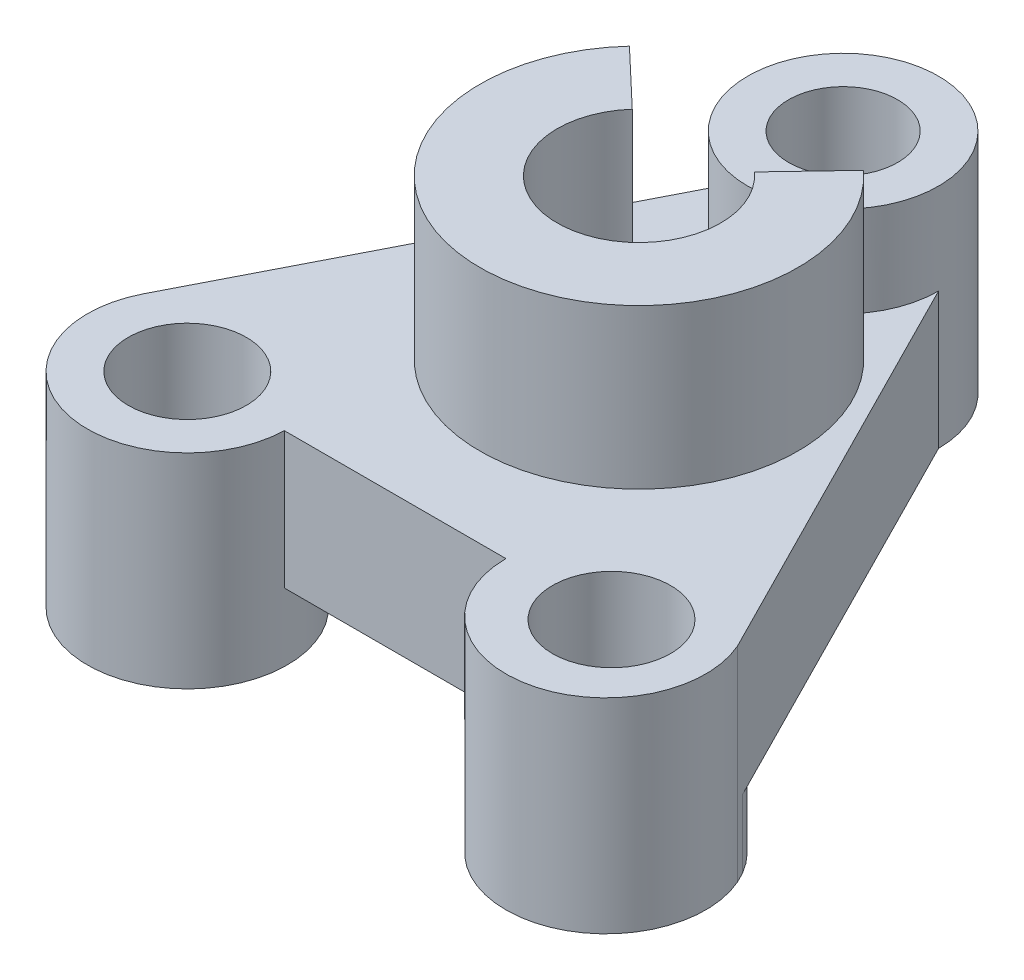
ISO-10303-21;
HEADER;
FILE_DESCRIPTION(('STEP AP214'),'2;1');
FILE_NAME('part.step','',(''),(''),'','','');
FILE_SCHEMA(('AUTOMOTIVE_DESIGN { 1 0 10303 214 1 1 1 1 }'));
ENDSEC;
DATA;
#1=APPLICATION_CONTEXT('core data for automotive mechanical design processes');
#2=APPLICATION_PROTOCOL_DEFINITION('international standard','automotive_design',2000,#1);
#3=PRODUCT_CONTEXT('',#1,'mechanical');
#4=PRODUCT('Part','Part','',(#3));
#5=PRODUCT_RELATED_PRODUCT_CATEGORY('part','',(#4));
#6=PRODUCT_DEFINITION_FORMATION('','',#4);
#7=PRODUCT_DEFINITION_CONTEXT('part definition',#1,'design');
#8=PRODUCT_DEFINITION('design','',#6,#7);
#9=PRODUCT_DEFINITION_SHAPE('','',#8);
#10=(LENGTH_UNIT() NAMED_UNIT(*) SI_UNIT(.MILLI.,.METRE.));
#11=(NAMED_UNIT(*) PLANE_ANGLE_UNIT() SI_UNIT($,.RADIAN.));
#12=(NAMED_UNIT(*) SI_UNIT($,.STERADIAN.) SOLID_ANGLE_UNIT());
#13=UNCERTAINTY_MEASURE_WITH_UNIT(LENGTH_MEASURE(1.E-05),#10,'distance_accuracy_value','');
#14=(GEOMETRIC_REPRESENTATION_CONTEXT(3) GLOBAL_UNCERTAINTY_ASSIGNED_CONTEXT((#13)) GLOBAL_UNIT_ASSIGNED_CONTEXT((#10,
#11,#12)) REPRESENTATION_CONTEXT('',''));
#15=CARTESIAN_POINT('',(0.,0.,0.));
#16=DIRECTION('',(0.,0.,1.));
#17=DIRECTION('',(1.,0.,0.));
#18=AXIS2_PLACEMENT_3D('',#15,#16,#17);
#19=CARTESIAN_POINT('',(0.,-30.,0.));
#20=DIRECTION('',(0.,1.,0.));
#21=DIRECTION('',(0.,0.,1.));
#22=AXIS2_PLACEMENT_3D('',#19,#20,#21);
#23=PLANE('',#22);
#24=CARTESIAN_POINT('',(-42.7481511678744,-30.,-83.4945297003622));
#25=DIRECTION('',(0.,1.,0.));
#26=DIRECTION('',(0.,0.,1.));
#27=AXIS2_PLACEMENT_3D('',#24,#25,#26);
#28=CIRCLE('',#27,12.);
#29=CARTESIAN_POINT('',(-42.7481511678744,-30.,-71.4945297003622));
#30=VERTEX_POINT('',#29);
#31=EDGE_CURVE('E184',#30,#30,#28,.T.);
#32=ORIENTED_EDGE('',*,*,#31,.T.);
#33=EDGE_LOOP('',(#32));
#34=FACE_BOUND('',#33,.T.);
#35=CARTESIAN_POINT('',(-89.1312520447951,-30.,14.5054702996378));
#36=DIRECTION('',(0.,1.,0.));
#37=DIRECTION('',(0.,0.,1.));
#38=AXIS2_PLACEMENT_3D('',#35,#36,#37);
#39=CIRCLE('',#38,22.);
#40=CARTESIAN_POINT('',(-108.720702630866,-30.,4.49280703076323));
#41=VERTEX_POINT('',#40);
#42=CARTESIAN_POINT('',(-67.1400575238637,-30.,15.1278556646305));
#43=VERTEX_POINT('',#42);
#44=EDGE_CURVE('E11',#41,#43,#39,.F.);
#45=ORIENTED_EDGE('',*,*,#44,.F.);
#46=DIRECTION('',(0.455121057676114,0.,-0.890429572094152));
#47=VECTOR('',#46,1.);
#48=CARTESIAN_POINT('',(-84.3800959878936,-30.,-43.128799555145));
#49=LINE('',#48,#47);
#50=CARTESIAN_POINT('',(-63.7481511678744,-30.,-83.4945297003622));
#51=VERTEX_POINT('',#50);
#52=EDGE_CURVE('E97',#41,#51,#49,.T.);
#53=ORIENTED_EDGE('',*,*,#52,.T.);
#54=CARTESIAN_POINT('',(-42.7481511678744,-30.,-83.4945297003622));
#55=DIRECTION('',(0.,1.,0.));
#56=DIRECTION('',(0.,0.,1.));
#57=AXIS2_PLACEMENT_3D('',#54,#55,#56);
#58=CIRCLE('',#57,21.);
#59=CARTESIAN_POINT('',(-21.7481511678744,-30.,-83.4945297003622));
#60=VERTEX_POINT('',#59);
#61=EDGE_CURVE('E157',#60,#51,#58,.T.);
#62=ORIENTED_EDGE('',*,*,#61,.F.);
#63=DIRECTION('',(-0.452339847965875,0.,-0.891845649169299));
#64=VECTOR('',#63,1.);
#65=CARTESIAN_POINT('',(16.3849069963001,-30.,-8.31034646695291));
#66=LINE('',#65,#64);
#67=CARTESIAN_POINT('',(22.6735761528181,-30.,4.08856610183062));
#68=VERTEX_POINT('',#67);
#69=EDGE_CURVE('E63',#68,#60,#66,.T.);
#70=ORIENTED_EDGE('',*,*,#69,.F.);
#71=CARTESIAN_POINT('',(3.64375518811497,-30.,15.1278556646305));
#72=DIRECTION('',(0.,-1.,0.));
#73=DIRECTION('',(0.,0.,-1.));
#74=AXIS2_PLACEMENT_3D('',#71,#72,#73);
#75=CIRCLE('',#74,22.);
#76=CARTESIAN_POINT('',(-18.356244811885,-30.,15.1278556646305));
#77=VERTEX_POINT('',#76);
#78=EDGE_CURVE('E47',#77,#68,#75,.T.);
#79=ORIENTED_EDGE('',*,*,#78,.F.);
#80=DIRECTION('',(1.,0.,0.));
#81=VECTOR('',#80,1.);
#82=CARTESIAN_POINT('',(0.,-30.,15.1278556646305));
#83=LINE('',#82,#81);
#84=EDGE_CURVE('E132',#43,#77,#83,.T.);
#85=ORIENTED_EDGE('',*,*,#84,.F.);
#86=EDGE_LOOP('',(#45,#53,#62,#70,#79,#85));
#87=FACE_BOUND('',#86,.T.);
#88=ADVANCED_FACE('F39',(#34,#87),#23,.F.);
#89=CARTESIAN_POINT('',(0.,0.,0.));
#90=DIRECTION('',(0.,1.,0.));
#91=DIRECTION('',(0.,0.,1.));
#92=AXIS2_PLACEMENT_3D('',#89,#90,#91);
#93=PLANE('',#92);
#94=CARTESIAN_POINT('',(-42.7481511678744,0.,-83.4945297003622));
#95=DIRECTION('',(0.,1.,0.));
#96=DIRECTION('',(0.,0.,1.));
#97=AXIS2_PLACEMENT_3D('',#94,#95,#96);
#98=CIRCLE('',#97,21.);
#99=CARTESIAN_POINT('',(-63.7481511678744,0.,-83.4945297003622));
#100=VERTEX_POINT('',#99);
#101=CARTESIAN_POINT('',(-21.7481511678744,0.,-83.4945297003622));
#102=VERTEX_POINT('',#101);
#103=EDGE_CURVE('E176',#100,#102,#98,.T.);
#104=ORIENTED_EDGE('',*,*,#103,.F.);
#105=DIRECTION('',(0.455121057676114,0.,-0.890429572094152));
#106=VECTOR('',#105,1.);
#107=CARTESIAN_POINT('',(-84.3800959878936,0.,-43.128799555145));
#108=LINE('',#107,#106);
#109=CARTESIAN_POINT('',(-108.720702630866,0.,4.49280703076323));
#110=VERTEX_POINT('',#109);
#111=EDGE_CURVE('E167',#110,#100,#108,.T.);
#112=ORIENTED_EDGE('',*,*,#111,.F.);
#113=CARTESIAN_POINT('',(-89.1312520447951,0.,14.5054702996378));
#114=DIRECTION('',(0.,1.,0.));
#115=DIRECTION('',(0.,0.,1.));
#116=AXIS2_PLACEMENT_3D('',#113,#114,#115);
#117=CIRCLE('',#116,22.);
#118=CARTESIAN_POINT('',(-67.1400575238637,0.,15.1278556646305));
#119=VERTEX_POINT('',#118);
#120=EDGE_CURVE('E140',#110,#119,#117,.T.);
#121=ORIENTED_EDGE('',*,*,#120,.T.);
#122=DIRECTION('',(1.,0.,0.));
#123=VECTOR('',#122,1.);
#124=CARTESIAN_POINT('',(0.,0.,15.1278556646305));
#125=LINE('',#124,#123);
#126=CARTESIAN_POINT('',(-18.356244811885,0.,15.1278556646305));
#127=VERTEX_POINT('',#126);
#128=EDGE_CURVE('E170',#119,#127,#125,.T.);
#129=ORIENTED_EDGE('',*,*,#128,.T.);
#130=CARTESIAN_POINT('',(3.64375518811497,0.,15.1278556646305));
#131=DIRECTION('',(0.,1.,0.));
#132=DIRECTION('',(0.,0.,1.));
#133=AXIS2_PLACEMENT_3D('',#130,#131,#132);
#134=CIRCLE('',#133,22.);
#135=CARTESIAN_POINT('',(23.793023230114,0.,6.29569865902453));
#136=VERTEX_POINT('',#135);
#137=EDGE_CURVE('E154',#127,#136,#134,.T.);
#138=ORIENTED_EDGE('',*,*,#137,.T.);
#139=DIRECTION('',(-0.452339847965875,0.,-0.891845649169299));
#140=VECTOR('',#139,1.);
#141=CARTESIAN_POINT('',(16.3849069963001,0.,-8.31034646695291));
#142=LINE('',#141,#140);
#143=EDGE_CURVE('E150',#136,#102,#142,.T.);
#144=ORIENTED_EDGE('',*,*,#143,.T.);
#145=EDGE_LOOP('',(#104,#112,#121,#129,#138,#144));
#146=FACE_BOUND('',#145,.T.);
#147=CARTESIAN_POINT('',(4.88409569661875,0.,15.1278556646305));
#148=DIRECTION('',(0.,1.,0.));
#149=DIRECTION('',(0.,0.,1.));
#150=AXIS2_PLACEMENT_3D('',#147,#148,#149);
#151=CIRCLE('',#150,13.);
#152=CARTESIAN_POINT('',(4.88409569661875,0.,28.1278556646306));
#153=VERTEX_POINT('',#152);
#154=EDGE_CURVE('E161',#153,#153,#151,.T.);
#155=ORIENTED_EDGE('',*,*,#154,.F.);
#156=EDGE_LOOP('',(#155));
#157=FACE_BOUND('',#156,.T.);
#158=CARTESIAN_POINT('',(-89.1312520447951,0.,14.5054702996378));
#159=DIRECTION('',(0.,1.,0.));
#160=DIRECTION('',(0.,0.,1.));
#161=AXIS2_PLACEMENT_3D('',#158,#159,#160);
#162=CIRCLE('',#161,13.);
#163=CARTESIAN_POINT('',(-89.1312520447951,0.,27.5054702996378));
#164=VERTEX_POINT('',#163);
#165=EDGE_CURVE('E164',#164,#164,#162,.T.);
#166=ORIENTED_EDGE('',*,*,#165,.F.);
#167=EDGE_LOOP('',(#166));
#168=FACE_BOUND('',#167,.T.);
#169=DIRECTION('',(-0.688389682218979,0.,0.725341054549136));
#170=VECTOR('',#169,1.);
#171=CARTESIAN_POINT('',(-29.7241666108098,0.,-50.9395675689508));
#172=LINE('',#171,#170);
#173=CARTESIAN_POINT('',(-18.0184740488299,0.,-63.2735981426885));
#174=VERTEX_POINT('',#173);
#175=CARTESIAN_POINT('',(-29.7241666108098,0.,-50.9395675689508));
#176=VERTEX_POINT('',#175);
#177=EDGE_CURVE('E211',#174,#176,#172,.T.);
#178=ORIENTED_EDGE('',*,*,#177,.F.);
#179=CARTESIAN_POINT('',(-41.6920802431945,0.,-37.4945297003622));
#180=DIRECTION('',(0.,1.,0.));
#181=DIRECTION('',(0.,0.,1.));
#182=AXIS2_PLACEMENT_3D('',#179,#180,#181);
#183=CIRCLE('',#182,35.);
#184=CARTESIAN_POINT('',(-67.4711486855208,0.,-61.1681358947268));
#185=VERTEX_POINT('',#184);
#186=EDGE_CURVE('E213',#185,#174,#183,.T.);
#187=ORIENTED_EDGE('',*,*,#186,.F.);
#188=DIRECTION('',(-0.725341054549136,0.,-0.688389682218979));
#189=VECTOR('',#188,1.);
#190=CARTESIAN_POINT('',(-55.1371181117831,0.,-49.4624433327468));
#191=LINE('',#190,#189);
#192=CARTESIAN_POINT('',(-55.1371181117831,0.,-49.4624433327468));
#193=VERTEX_POINT('',#192);
#194=EDGE_CURVE('E206',#193,#185,#191,.T.);
#195=ORIENTED_EDGE('',*,*,#194,.F.);
#196=CARTESIAN_POINT('',(-41.6920802431945,0.,-37.4945297003622));
#197=DIRECTION('',(0.,-1.,0.));
#198=DIRECTION('',(0.,0.,1.));
#199=AXIS2_PLACEMENT_3D('',#196,#197,#198);
#200=CIRCLE('',#199,18.);
#201=EDGE_CURVE('E209',#176,#193,#200,.T.);
#202=ORIENTED_EDGE('',*,*,#201,.F.);
#203=EDGE_LOOP('',(#178,#187,#195,#202));
#204=FACE_BOUND('',#203,.T.);
#205=ADVANCED_FACE('F258',(#146,#157,#168,#204),#93,.T.);
#206=CARTESIAN_POINT('',(16.3849069963001,-30.,-8.31034646695291));
#207=DIRECTION('',(0.891845649169299,0.,-0.452339847965875));
#208=DIRECTION('',(-0.452339847965875,0.,-0.891845649169299));
#209=AXIS2_PLACEMENT_3D('',#206,#207,#208);
#210=PLANE('',#209);
#211=ORIENTED_EDGE('',*,*,#143,.F.);
#212=DIRECTION('',(0.,1.,0.));
#213=VECTOR('',#212,1.);
#214=CARTESIAN_POINT('',(23.793023230114,-30.,6.29569865902453));
#215=LINE('',#214,#213);
#216=CARTESIAN_POINT('',(23.793023230114,-45.,6.29569865902452));
#217=VERTEX_POINT('',#216);
#218=EDGE_CURVE('E89',#217,#136,#215,.T.);
#219=ORIENTED_EDGE('',*,*,#218,.F.);
#220=DIRECTION('',(0.452339847965875,0.,0.891845649169299));
#221=VECTOR('',#220,1.);
#222=CARTESIAN_POINT('',(16.3849069963001,-45.,-8.31034646695291));
#223=LINE('',#222,#221);
#224=CARTESIAN_POINT('',(22.6735761528181,-45.,4.08856610183062));
#225=VERTEX_POINT('',#224);
#226=EDGE_CURVE('E225',#225,#217,#223,.T.);
#227=ORIENTED_EDGE('',*,*,#226,.F.);
#228=DIRECTION('',(0.,1.,0.));
#229=VECTOR('',#228,1.);
#230=CARTESIAN_POINT('',(22.6735761528181,-45.,4.08856610183062));
#231=LINE('',#230,#229);
#232=EDGE_CURVE('E216',#225,#68,#231,.T.);
#233=ORIENTED_EDGE('',*,*,#232,.T.);
#234=ORIENTED_EDGE('',*,*,#69,.T.);
#235=DIRECTION('',(0.,1.,0.));
#236=VECTOR('',#235,1.);
#237=CARTESIAN_POINT('',(-21.7481511678744,-30.,-83.4945297003622));
#238=LINE('',#237,#236);
#239=EDGE_CURVE('E174',#60,#102,#238,.T.);
#240=ORIENTED_EDGE('',*,*,#239,.T.);
#241=EDGE_LOOP('',(#211,#219,#227,#233,#234,#240));
#242=FACE_BOUND('',#241,.T.);
#243=ADVANCED_FACE('F263',(#242),#210,.T.);
#244=CARTESIAN_POINT('',(3.64375518811497,-30.,15.1278556646305));
#245=DIRECTION('',(0.,1.,0.));
#246=DIRECTION('',(0.,0.,1.));
#247=AXIS2_PLACEMENT_3D('',#244,#245,#246);
#248=CYLINDRICAL_SURFACE('',#247,22.);
#249=ORIENTED_EDGE('',*,*,#137,.F.);
#250=DIRECTION('',(0.,1.,0.));
#251=VECTOR('',#250,1.);
#252=CARTESIAN_POINT('',(-18.356244811885,-30.,15.1278556646305));
#253=LINE('',#252,#251);
#254=EDGE_CURVE('E178',#77,#127,#253,.T.);
#255=ORIENTED_EDGE('',*,*,#254,.F.);
#256=ORIENTED_EDGE('',*,*,#78,.T.);
#257=ORIENTED_EDGE('',*,*,#232,.F.);
#258=CARTESIAN_POINT('',(3.64375518811497,-45.,15.1278556646305));
#259=DIRECTION('',(0.,-1.,0.));
#260=DIRECTION('',(0.,0.,-1.));
#261=AXIS2_PLACEMENT_3D('',#258,#259,#260);
#262=CIRCLE('',#261,22.);
#263=EDGE_CURVE('E230',#217,#225,#262,.T.);
#264=ORIENTED_EDGE('',*,*,#263,.F.);
#265=ORIENTED_EDGE('',*,*,#218,.T.);
#266=EDGE_LOOP('',(#249,#255,#256,#257,#264,#265));
#267=FACE_BOUND('',#266,.T.);
#268=ADVANCED_FACE('F271',(#267),#248,.T.);
#269=CARTESIAN_POINT('',(0.,-30.,15.1278556646305));
#270=DIRECTION('',(0.,0.,1.));
#271=DIRECTION('',(1.,0.,0.));
#272=AXIS2_PLACEMENT_3D('',#269,#270,#271);
#273=PLANE('',#272);
#274=ORIENTED_EDGE('',*,*,#128,.F.);
#275=DIRECTION('',(0.,1.,0.));
#276=VECTOR('',#275,1.);
#277=CARTESIAN_POINT('',(-67.1400575238637,-30.,15.1278556646305));
#278=LINE('',#277,#276);
#279=EDGE_CURVE('E144',#43,#119,#278,.T.);
#280=ORIENTED_EDGE('',*,*,#279,.F.);
#281=ORIENTED_EDGE('',*,*,#84,.T.);
#282=ORIENTED_EDGE('',*,*,#254,.T.);
#283=EDGE_LOOP('',(#274,#280,#281,#282));
#284=FACE_BOUND('',#283,.T.);
#285=ADVANCED_FACE('F254',(#284),#273,.T.);
#286=CARTESIAN_POINT('',(-89.1312520447951,-30.,14.5054702996378));
#287=DIRECTION('',(0.,1.,0.));
#288=DIRECTION('',(0.,0.,1.));
#289=AXIS2_PLACEMENT_3D('',#286,#287,#288);
#290=CYLINDRICAL_SURFACE('',#289,22.);
#291=ORIENTED_EDGE('',*,*,#120,.F.);
#292=DIRECTION('',(0.,1.,0.));
#293=VECTOR('',#292,1.);
#294=CARTESIAN_POINT('',(-108.720702630866,-30.,4.49280703076323));
#295=LINE('',#294,#293);
#296=EDGE_CURVE('E136',#41,#110,#295,.T.);
#297=ORIENTED_EDGE('',*,*,#296,.F.);
#298=ORIENTED_EDGE('',*,*,#44,.T.);
#299=ORIENTED_EDGE('',*,*,#279,.T.);
#300=EDGE_LOOP('',(#291,#297,#298,#299));
#301=FACE_BOUND('',#300,.T.);
#302=CARTESIAN_POINT('',(-89.1312520447951,-45.,14.5054702996378));
#303=DIRECTION('',(0.,-1.,0.));
#304=DIRECTION('',(0.,0.,-1.));
#305=AXIS2_PLACEMENT_3D('',#302,#303,#304);
#306=CIRCLE('',#305,22.);
#307=CARTESIAN_POINT('',(-89.1312520447951,-45.,-7.49452970036224));
#308=VERTEX_POINT('',#307);
#309=EDGE_CURVE('E236',#308,#308,#306,.T.);
#310=ORIENTED_EDGE('',*,*,#309,.F.);
#311=EDGE_LOOP('',(#310));
#312=FACE_BOUND('',#311,.T.);
#313=ADVANCED_FACE('F137',(#301,#312),#290,.T.);
#314=CARTESIAN_POINT('',(-89.1312520447951,-30.,14.5054702996378));
#315=DIRECTION('',(0.,1.,0.));
#316=DIRECTION('',(0.,0.,1.));
#317=AXIS2_PLACEMENT_3D('',#314,#315,#316);
#318=CYLINDRICAL_SURFACE('',#317,13.);
#319=ORIENTED_EDGE('',*,*,#165,.T.);
#320=EDGE_LOOP('',(#319));
#321=FACE_BOUND('',#320,.T.);
#322=CARTESIAN_POINT('',(-89.1312520447951,-45.,14.5054702996378));
#323=DIRECTION('',(0.,-1.,0.));
#324=DIRECTION('',(0.,0.,-1.));
#325=AXIS2_PLACEMENT_3D('',#322,#323,#324);
#326=CIRCLE('',#325,13.);
#327=CARTESIAN_POINT('',(-89.1312520447951,-45.,1.50547029963775));
#328=VERTEX_POINT('',#327);
#329=EDGE_CURVE('E239',#328,#328,#326,.F.);
#330=ORIENTED_EDGE('',*,*,#329,.F.);
#331=EDGE_LOOP('',(#330));
#332=FACE_BOUND('',#331,.T.);
#333=ADVANCED_FACE('F246',(#321,#332),#318,.F.);
#334=CARTESIAN_POINT('',(4.88409569661875,-30.,15.1278556646305));
#335=DIRECTION('',(0.,1.,0.));
#336=DIRECTION('',(0.,0.,1.));
#337=AXIS2_PLACEMENT_3D('',#334,#335,#336);
#338=CYLINDRICAL_SURFACE('',#337,13.);
#339=ORIENTED_EDGE('',*,*,#154,.T.);
#340=EDGE_LOOP('',(#339));
#341=FACE_BOUND('',#340,.T.);
#342=CARTESIAN_POINT('',(4.88409569661875,-45.,15.1278556646305));
#343=DIRECTION('',(0.,-1.,0.));
#344=DIRECTION('',(0.,0.,-1.));
#345=AXIS2_PLACEMENT_3D('',#342,#343,#344);
#346=CIRCLE('',#345,13.);
#347=CARTESIAN_POINT('',(4.88409569661875,-45.,2.12785566463054));
#348=VERTEX_POINT('',#347);
#349=EDGE_CURVE('E233',#348,#348,#346,.F.);
#350=ORIENTED_EDGE('',*,*,#349,.F.);
#351=EDGE_LOOP('',(#350));
#352=FACE_BOUND('',#351,.T.);
#353=ADVANCED_FACE('F41',(#341,#352),#338,.F.);
#354=CARTESIAN_POINT('',(-84.3800959878936,-30.,-43.128799555145));
#355=DIRECTION('',(0.890429572094152,0.,0.455121057676114));
#356=DIRECTION('',(0.455121057676114,0.,-0.890429572094152));
#357=AXIS2_PLACEMENT_3D('',#354,#355,#356);
#358=PLANE('',#357);
#359=ORIENTED_EDGE('',*,*,#111,.T.);
#360=DIRECTION('',(0.,1.,0.));
#361=VECTOR('',#360,1.);
#362=CARTESIAN_POINT('',(-63.7481511678744,-30.,-83.4945297003622));
#363=LINE('',#362,#361);
#364=EDGE_CURVE('E145',#51,#100,#363,.T.);
#365=ORIENTED_EDGE('',*,*,#364,.F.);
#366=ORIENTED_EDGE('',*,*,#52,.F.);
#367=ORIENTED_EDGE('',*,*,#296,.T.);
#368=EDGE_LOOP('',(#359,#365,#366,#367));
#369=FACE_BOUND('',#368,.T.);
#370=ADVANCED_FACE('F147',(#369),#358,.F.);
#371=CARTESIAN_POINT('',(-42.7481511678744,-30.,-83.4945297003622));
#372=DIRECTION('',(0.,1.,0.));
#373=DIRECTION('',(0.,0.,1.));
#374=AXIS2_PLACEMENT_3D('',#371,#372,#373);
#375=CYLINDRICAL_SURFACE('',#374,21.);
#376=ORIENTED_EDGE('',*,*,#364,.T.);
#377=ORIENTED_EDGE('',*,*,#103,.T.);
#378=ORIENTED_EDGE('',*,*,#239,.F.);
#379=ORIENTED_EDGE('',*,*,#61,.T.);
#380=EDGE_LOOP('',(#376,#377,#378,#379));
#381=FACE_BOUND('',#380,.T.);
#382=CARTESIAN_POINT('',(-42.7481511678744,20.,-83.4945297003622));
#383=DIRECTION('',(0.,1.,0.));
#384=DIRECTION('',(0.,0.,1.));
#385=AXIS2_PLACEMENT_3D('',#382,#383,#384);
#386=CIRCLE('',#385,21.);
#387=CARTESIAN_POINT('',(-42.7481511678744,20.,-62.4945297003622));
#388=VERTEX_POINT('',#387);
#389=EDGE_CURVE('E186',#388,#388,#386,.T.);
#390=ORIENTED_EDGE('',*,*,#389,.F.);
#391=EDGE_LOOP('',(#390));
#392=FACE_BOUND('',#391,.T.);
#393=ADVANCED_FACE('F182',(#381,#392),#375,.T.);
#394=CARTESIAN_POINT('',(-42.7481511678744,-30.,-83.4945297003622));
#395=DIRECTION('',(0.,1.,0.));
#396=DIRECTION('',(0.,0.,1.));
#397=AXIS2_PLACEMENT_3D('',#394,#395,#396);
#398=CYLINDRICAL_SURFACE('',#397,12.);
#399=ORIENTED_EDGE('',*,*,#31,.F.);
#400=EDGE_LOOP('',(#399));
#401=FACE_BOUND('',#400,.T.);
#402=CARTESIAN_POINT('',(-42.7481511678744,20.,-83.4945297003622));
#403=DIRECTION('',(0.,1.,0.));
#404=DIRECTION('',(0.,0.,1.));
#405=AXIS2_PLACEMENT_3D('',#402,#403,#404);
#406=CIRCLE('',#405,12.);
#407=CARTESIAN_POINT('',(-42.7481511678744,20.,-71.4945297003622));
#408=VERTEX_POINT('',#407);
#409=EDGE_CURVE('E190',#408,#408,#406,.T.);
#410=ORIENTED_EDGE('',*,*,#409,.T.);
#411=EDGE_LOOP('',(#410));
#412=FACE_BOUND('',#411,.T.);
#413=ADVANCED_FACE('F280',(#401,#412),#398,.F.);
#414=CARTESIAN_POINT('',(-42.7481511678744,20.,-83.4945297003622));
#415=DIRECTION('',(0.,1.,0.));
#416=DIRECTION('',(0.,0.,1.));
#417=AXIS2_PLACEMENT_3D('',#414,#415,#416);
#418=PLANE('',#417);
#419=ORIENTED_EDGE('',*,*,#409,.F.);
#420=EDGE_LOOP('',(#419));
#421=FACE_BOUND('',#420,.T.);
#422=ORIENTED_EDGE('',*,*,#389,.T.);
#423=EDGE_LOOP('',(#422));
#424=FACE_BOUND('',#423,.T.);
#425=ADVANCED_FACE('F284',(#421,#424),#418,.T.);
#426=CARTESIAN_POINT('',(-41.6920802431945,35.,-37.4945297003622));
#427=DIRECTION('',(0.,-1.,0.));
#428=DIRECTION('',(0.,0.,-1.));
#429=AXIS2_PLACEMENT_3D('',#426,#427,#428);
#430=CYLINDRICAL_SURFACE('',#429,35.);
#431=ORIENTED_EDGE('',*,*,#186,.T.);
#432=DIRECTION('',(0.,-1.,0.));
#433=VECTOR('',#432,1.);
#434=CARTESIAN_POINT('',(-18.0184740488299,35.,-63.2735981426885));
#435=LINE('',#434,#433);
#436=CARTESIAN_POINT('',(-18.0184740488299,35.,-63.2735981426885));
#437=VERTEX_POINT('',#436);
#438=EDGE_CURVE('E196',#437,#174,#435,.T.);
#439=ORIENTED_EDGE('',*,*,#438,.F.);
#440=CARTESIAN_POINT('',(-41.6920802431945,35.,-37.4945297003622));
#441=DIRECTION('',(0.,1.,0.));
#442=DIRECTION('',(0.,0.,1.));
#443=AXIS2_PLACEMENT_3D('',#440,#441,#442);
#444=CIRCLE('',#443,35.);
#445=CARTESIAN_POINT('',(-67.4711486855208,35.,-61.1681358947268));
#446=VERTEX_POINT('',#445);
#447=EDGE_CURVE('E208',#446,#437,#444,.T.);
#448=ORIENTED_EDGE('',*,*,#447,.F.);
#449=DIRECTION('',(0.,-1.,0.));
#450=VECTOR('',#449,1.);
#451=CARTESIAN_POINT('',(-67.4711486855208,35.,-61.1681358947268));
#452=LINE('',#451,#450);
#453=EDGE_CURVE('E202',#446,#185,#452,.T.);
#454=ORIENTED_EDGE('',*,*,#453,.T.);
#455=EDGE_LOOP('',(#431,#439,#448,#454));
#456=FACE_BOUND('',#455,.T.);
#457=ADVANCED_FACE('F289',(#456),#430,.T.);
#458=CARTESIAN_POINT('',(-29.7241666108098,35.,-50.9395675689508));
#459=DIRECTION('',(0.725341054549136,0.,0.688389682218979));
#460=DIRECTION('',(0.688389682218979,0.,-0.725341054549136));
#461=AXIS2_PLACEMENT_3D('',#458,#459,#460);
#462=PLANE('',#461);
#463=ORIENTED_EDGE('',*,*,#177,.T.);
#464=DIRECTION('',(0.,-1.,0.));
#465=VECTOR('',#464,1.);
#466=CARTESIAN_POINT('',(-29.7241666108098,35.,-50.9395675689508));
#467=LINE('',#466,#465);
#468=CARTESIAN_POINT('',(-29.7241666108098,35.,-50.9395675689508));
#469=VERTEX_POINT('',#468);
#470=EDGE_CURVE('E198',#469,#176,#467,.T.);
#471=ORIENTED_EDGE('',*,*,#470,.F.);
#472=DIRECTION('',(-0.688389682218979,0.,0.725341054549136));
#473=VECTOR('',#472,1.);
#474=CARTESIAN_POINT('',(-29.7241666108098,35.,-50.9395675689508));
#475=LINE('',#474,#473);
#476=EDGE_CURVE('E220',#437,#469,#475,.T.);
#477=ORIENTED_EDGE('',*,*,#476,.F.);
#478=ORIENTED_EDGE('',*,*,#438,.T.);
#479=EDGE_LOOP('',(#463,#471,#477,#478));
#480=FACE_BOUND('',#479,.T.);
#481=ADVANCED_FACE('F296',(#480),#462,.F.);
#482=CARTESIAN_POINT('',(-41.6920802431945,35.,-37.4945297003622));
#483=DIRECTION('',(0.,-1.,0.));
#484=DIRECTION('',(0.,0.,-1.));
#485=AXIS2_PLACEMENT_3D('',#482,#483,#484);
#486=CYLINDRICAL_SURFACE('',#485,18.);
#487=ORIENTED_EDGE('',*,*,#201,.T.);
#488=DIRECTION('',(0.,-1.,0.));
#489=VECTOR('',#488,1.);
#490=CARTESIAN_POINT('',(-55.1371181117831,35.,-49.4624433327468));
#491=LINE('',#490,#489);
#492=CARTESIAN_POINT('',(-55.1371181117831,35.,-49.4624433327468));
#493=VERTEX_POINT('',#492);
#494=EDGE_CURVE('E54',#493,#193,#491,.T.);
#495=ORIENTED_EDGE('',*,*,#494,.F.);
#496=CARTESIAN_POINT('',(-41.6920802431945,35.,-37.4945297003622));
#497=DIRECTION('',(0.,-1.,0.));
#498=DIRECTION('',(0.,0.,1.));
#499=AXIS2_PLACEMENT_3D('',#496,#497,#498);
#500=CIRCLE('',#499,18.);
#501=EDGE_CURVE('E218',#469,#493,#500,.T.);
#502=ORIENTED_EDGE('',*,*,#501,.F.);
#503=ORIENTED_EDGE('',*,*,#470,.T.);
#504=EDGE_LOOP('',(#487,#495,#502,#503));
#505=FACE_BOUND('',#504,.T.);
#506=ADVANCED_FACE('F300',(#505),#486,.F.);
#507=CARTESIAN_POINT('',(-55.1371181117831,35.,-49.4624433327468));
#508=DIRECTION('',(-0.688389682218979,0.,0.725341054549136));
#509=DIRECTION('',(0.725341054549136,0.,0.688389682218979));
#510=AXIS2_PLACEMENT_3D('',#507,#508,#509);
#511=PLANE('',#510);
#512=ORIENTED_EDGE('',*,*,#194,.T.);
#513=ORIENTED_EDGE('',*,*,#453,.F.);
#514=DIRECTION('',(-0.725341054549136,0.,-0.688389682218979));
#515=VECTOR('',#514,1.);
#516=CARTESIAN_POINT('',(-55.1371181117831,35.,-49.4624433327468));
#517=LINE('',#516,#515);
#518=EDGE_CURVE('E205',#493,#446,#517,.T.);
#519=ORIENTED_EDGE('',*,*,#518,.F.);
#520=ORIENTED_EDGE('',*,*,#494,.T.);
#521=EDGE_LOOP('',(#512,#513,#519,#520));
#522=FACE_BOUND('',#521,.T.);
#523=ADVANCED_FACE('F304',(#522),#511,.F.);
#524=CARTESIAN_POINT('',(-41.6920802431945,35.,-37.4945297003622));
#525=DIRECTION('',(0.,1.,0.));
#526=DIRECTION('',(0.,0.,1.));
#527=AXIS2_PLACEMENT_3D('',#524,#525,#526);
#528=PLANE('',#527);
#529=ORIENTED_EDGE('',*,*,#447,.T.);
#530=ORIENTED_EDGE('',*,*,#476,.T.);
#531=ORIENTED_EDGE('',*,*,#501,.T.);
#532=ORIENTED_EDGE('',*,*,#518,.T.);
#533=EDGE_LOOP('',(#529,#530,#531,#532));
#534=FACE_BOUND('',#533,.T.);
#535=ADVANCED_FACE('F308',(#534),#528,.T.);
#536=CARTESIAN_POINT('',(0.,-45.,0.));
#537=DIRECTION('',(0.,-1.,0.));
#538=DIRECTION('',(0.,0.,-1.));
#539=AXIS2_PLACEMENT_3D('',#536,#537,#538);
#540=PLANE('',#539);
#541=ORIENTED_EDGE('',*,*,#349,.T.);
#542=EDGE_LOOP('',(#541));
#543=FACE_BOUND('',#542,.T.);
#544=ORIENTED_EDGE('',*,*,#263,.T.);
#545=ORIENTED_EDGE('',*,*,#226,.T.);
#546=EDGE_LOOP('',(#544,#545));
#547=FACE_BOUND('',#546,.T.);
#548=ADVANCED_FACE('F311',(#543,#547),#540,.T.);
#549=CARTESIAN_POINT('',(0.,-45.,0.));
#550=DIRECTION('',(0.,-1.,0.));
#551=DIRECTION('',(0.,0.,-1.));
#552=AXIS2_PLACEMENT_3D('',#549,#550,#551);
#553=PLANE('',#552);
#554=ORIENTED_EDGE('',*,*,#329,.T.);
#555=EDGE_LOOP('',(#554));
#556=FACE_BOUND('',#555,.T.);
#557=ORIENTED_EDGE('',*,*,#309,.T.);
#558=EDGE_LOOP('',(#557));
#559=FACE_BOUND('',#558,.T.);
#560=ADVANCED_FACE('F243',(#556,#559),#553,.T.);
#561=CLOSED_SHELL('',(#88,#205,#243,#268,#285,#313,#333,#353,#370,#393,#413,#425,#457,#481,#506,
#523,#535,#548,#560));
#562=MANIFOLD_SOLID_BREP('B2',#561);
#563=ADVANCED_BREP_SHAPE_REPRESENTATION('',(#18,#562),#14);
#564=SHAPE_DEFINITION_REPRESENTATION(#9,#563);
ENDSEC;
END-ISO-10303-21;
